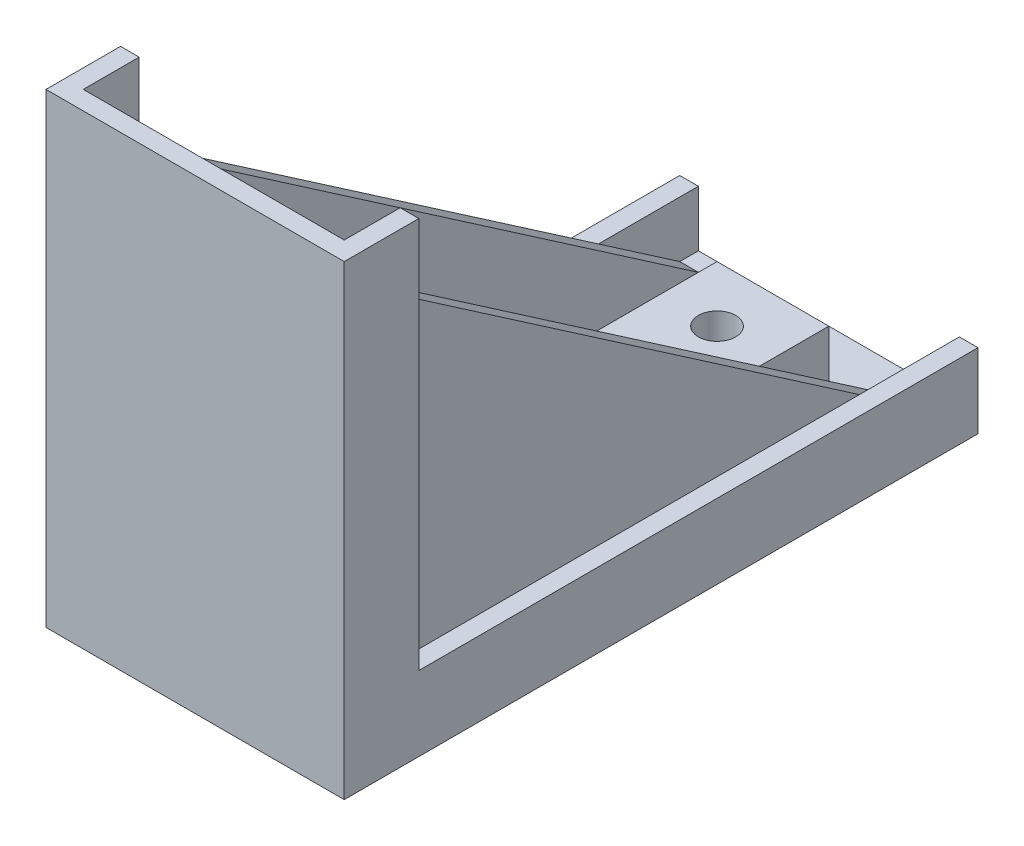
ISO-10303-21;
HEADER;
FILE_DESCRIPTION(('STEP AP214'),'2;1');
FILE_NAME('part.step','',(''),(''),'','','');
FILE_SCHEMA(('AUTOMOTIVE_DESIGN { 1 0 10303 214 1 1 1 1 }'));
ENDSEC;
DATA;
#1=APPLICATION_CONTEXT('core data for automotive mechanical design processes');
#2=APPLICATION_PROTOCOL_DEFINITION('international standard','automotive_design',2000,#1);
#3=PRODUCT_CONTEXT('',#1,'mechanical');
#4=PRODUCT('Part','Part','',(#3));
#5=PRODUCT_RELATED_PRODUCT_CATEGORY('part','',(#4));
#6=PRODUCT_DEFINITION_FORMATION('','',#4);
#7=PRODUCT_DEFINITION_CONTEXT('part definition',#1,'design');
#8=PRODUCT_DEFINITION('design','',#6,#7);
#9=PRODUCT_DEFINITION_SHAPE('','',#8);
#10=(LENGTH_UNIT() NAMED_UNIT(*) SI_UNIT(.MILLI.,.METRE.));
#11=(NAMED_UNIT(*) PLANE_ANGLE_UNIT() SI_UNIT($,.RADIAN.));
#12=(NAMED_UNIT(*) SI_UNIT($,.STERADIAN.) SOLID_ANGLE_UNIT());
#13=UNCERTAINTY_MEASURE_WITH_UNIT(LENGTH_MEASURE(1.E-05),#10,'distance_accuracy_value','');
#14=(GEOMETRIC_REPRESENTATION_CONTEXT(3) GLOBAL_UNCERTAINTY_ASSIGNED_CONTEXT((#13)) GLOBAL_UNIT_ASSIGNED_CONTEXT((#10,
#11,#12)) REPRESENTATION_CONTEXT('',''));
#15=CARTESIAN_POINT('',(0.,0.,0.));
#16=DIRECTION('',(0.,0.,1.));
#17=DIRECTION('',(1.,0.,0.));
#18=AXIS2_PLACEMENT_3D('',#15,#16,#17);
#19=CARTESIAN_POINT('',(-8.75,31.25,-1.25));
#20=DIRECTION('',(-1.,0.,0.));
#21=DIRECTION('',(0.,0.,1.));
#22=AXIS2_PLACEMENT_3D('',#19,#20,#21);
#23=PLANE('',#22);
#24=DIRECTION('',(0.,-1.,0.));
#25=VECTOR('',#24,1.);
#26=CARTESIAN_POINT('',(-8.75,31.25,-1.25));
#27=LINE('',#26,#25);
#28=CARTESIAN_POINT('',(-8.75,31.25,-1.25));
#29=VERTEX_POINT('',#28);
#30=CARTESIAN_POINT('',(-8.75,28.75,-1.25));
#31=VERTEX_POINT('',#30);
#32=EDGE_CURVE('E327',#29,#31,#27,.T.);
#33=ORIENTED_EDGE('',*,*,#32,.T.);
#34=DIRECTION('',(0.,0.566528822887065,0.824041924199368));
#35=VECTOR('',#34,1.);
#36=CARTESIAN_POINT('',(-8.75,1.25,-41.25));
#37=LINE('',#36,#35);
#38=CARTESIAN_POINT('',(-8.75,26.171875,-5.));
#39=VERTEX_POINT('',#38);
#40=EDGE_CURVE('E220',#39,#31,#37,.T.);
#41=ORIENTED_EDGE('',*,*,#40,.F.);
#42=DIRECTION('',(0.,-1.,0.));
#43=VECTOR('',#42,1.);
#44=CARTESIAN_POINT('',(-8.75,31.25,-5.));
#45=LINE('',#44,#43);
#46=CARTESIAN_POINT('',(-8.75,31.25,-5.));
#47=VERTEX_POINT('',#46);
#48=EDGE_CURVE('E324',#47,#39,#45,.T.);
#49=ORIENTED_EDGE('',*,*,#48,.F.);
#50=DIRECTION('',(0.,0.,-1.));
#51=VECTOR('',#50,1.);
#52=CARTESIAN_POINT('',(-8.75,31.25,-1.25));
#53=LINE('',#52,#51);
#54=EDGE_CURVE('E313',#29,#47,#53,.T.);
#55=ORIENTED_EDGE('',*,*,#54,.F.);
#56=EDGE_LOOP('',(#33,#41,#49,#55));
#57=FACE_BOUND('',#56,.T.);
#58=ADVANCED_FACE('F37',(#57),#23,.F.);
#59=CARTESIAN_POINT('',(8.75,31.25,-5.));
#60=DIRECTION('',(1.,0.,0.));
#61=DIRECTION('',(0.,0.,-1.));
#62=AXIS2_PLACEMENT_3D('',#59,#60,#61);
#63=PLANE('',#62);
#64=DIRECTION('',(0.,0.566528822887065,0.824041924199368));
#65=VECTOR('',#64,1.);
#66=CARTESIAN_POINT('',(8.75,1.25,-41.25));
#67=LINE('',#66,#65);
#68=CARTESIAN_POINT('',(8.75,26.171875,-5.));
#69=VERTEX_POINT('',#68);
#70=CARTESIAN_POINT('',(8.75,28.75,-1.25));
#71=VERTEX_POINT('',#70);
#72=EDGE_CURVE('E239',#69,#71,#67,.T.);
#73=ORIENTED_EDGE('',*,*,#72,.T.);
#74=DIRECTION('',(0.,-1.,0.));
#75=VECTOR('',#74,1.);
#76=CARTESIAN_POINT('',(8.75,31.25,-1.25));
#77=LINE('',#76,#75);
#78=CARTESIAN_POINT('',(8.75,31.25,-1.25));
#79=VERTEX_POINT('',#78);
#80=EDGE_CURVE('E330',#79,#71,#77,.T.);
#81=ORIENTED_EDGE('',*,*,#80,.F.);
#82=DIRECTION('',(0.,0.,1.));
#83=VECTOR('',#82,1.);
#84=CARTESIAN_POINT('',(8.75,31.25,-5.));
#85=LINE('',#84,#83);
#86=CARTESIAN_POINT('',(8.75,31.25,-5.));
#87=VERTEX_POINT('',#86);
#88=EDGE_CURVE('E309',#87,#79,#85,.T.);
#89=ORIENTED_EDGE('',*,*,#88,.F.);
#90=DIRECTION('',(0.,-1.,0.));
#91=VECTOR('',#90,1.);
#92=CARTESIAN_POINT('',(8.75,31.25,-5.));
#93=LINE('',#92,#91);
#94=EDGE_CURVE('E333',#87,#69,#93,.T.);
#95=ORIENTED_EDGE('',*,*,#94,.T.);
#96=EDGE_LOOP('',(#73,#81,#89,#95));
#97=FACE_BOUND('',#96,.T.);
#98=ADVANCED_FACE('F408',(#97),#63,.F.);
#99=CARTESIAN_POINT('',(8.75,1.25,-41.25));
#100=VERTEX_POINT('',#99);
#101=CARTESIAN_POINT('',(8.75,5.,-35.7954545454546));
#102=VERTEX_POINT('',#101);
#103=EDGE_CURVE('E235',#100,#102,#67,.T.);
#104=ORIENTED_EDGE('',*,*,#103,.T.);
#105=DIRECTION('',(0.,0.,1.));
#106=VECTOR('',#105,1.);
#107=CARTESIAN_POINT('',(8.75,5.,-42.5));
#108=LINE('',#107,#106);
#109=CARTESIAN_POINT('',(8.75,5.,-42.5));
#110=VERTEX_POINT('',#109);
#111=EDGE_CURVE('E275',#110,#102,#108,.T.);
#112=ORIENTED_EDGE('',*,*,#111,.F.);
#113=DIRECTION('',(0.,1.,0.));
#114=VECTOR('',#113,1.);
#115=CARTESIAN_POINT('',(8.75,1.25,-42.5));
#116=LINE('',#115,#114);
#117=CARTESIAN_POINT('',(8.75,1.25,-42.5));
#118=VERTEX_POINT('',#117);
#119=EDGE_CURVE('E273',#118,#110,#116,.T.);
#120=ORIENTED_EDGE('',*,*,#119,.F.);
#121=DIRECTION('',(0.,0.,1.));
#122=VECTOR('',#121,1.);
#123=CARTESIAN_POINT('',(8.75,1.25,-42.5));
#124=LINE('',#123,#122);
#125=EDGE_CURVE('E279',#118,#100,#124,.T.);
#126=ORIENTED_EDGE('',*,*,#125,.T.);
#127=EDGE_LOOP('',(#104,#112,#120,#126));
#128=FACE_BOUND('',#127,.T.);
#129=ADVANCED_FACE('F396',(#128),#63,.F.);
#130=CARTESIAN_POINT('',(8.75,31.25,-1.25));
#131=DIRECTION('',(0.,0.,1.));
#132=DIRECTION('',(1.,0.,0.));
#133=AXIS2_PLACEMENT_3D('',#130,#131,#132);
#134=PLANE('',#133);
#135=DIRECTION('',(0.,-1.,0.));
#136=VECTOR('',#135,1.);
#137=CARTESIAN_POINT('',(-7.5,28.75,-1.25));
#138=LINE('',#137,#136);
#139=CARTESIAN_POINT('',(-7.5,28.75,-1.25));
#140=VERTEX_POINT('',#139);
#141=CARTESIAN_POINT('',(-7.5,1.25,-1.25));
#142=VERTEX_POINT('',#141);
#143=EDGE_CURVE('E224',#140,#142,#138,.T.);
#144=ORIENTED_EDGE('',*,*,#143,.F.);
#145=DIRECTION('',(1.,0.,0.));
#146=VECTOR('',#145,1.);
#147=CARTESIAN_POINT('',(-8.75,28.75,-1.25));
#148=LINE('',#147,#146);
#149=EDGE_CURVE('E218',#31,#140,#148,.T.);
#150=ORIENTED_EDGE('',*,*,#149,.F.);
#151=ORIENTED_EDGE('',*,*,#32,.F.);
#152=DIRECTION('',(-1.,0.,0.));
#153=VECTOR('',#152,1.);
#154=CARTESIAN_POINT('',(8.75,31.25,-1.25));
#155=LINE('',#154,#153);
#156=EDGE_CURVE('E311',#79,#29,#155,.T.);
#157=ORIENTED_EDGE('',*,*,#156,.F.);
#158=ORIENTED_EDGE('',*,*,#80,.T.);
#159=DIRECTION('',(-1.,0.,0.));
#160=VECTOR('',#159,1.);
#161=CARTESIAN_POINT('',(8.75,28.75,-1.25));
#162=LINE('',#161,#160);
#163=CARTESIAN_POINT('',(7.5,28.75,-1.25));
#164=VERTEX_POINT('',#163);
#165=EDGE_CURVE('E249',#71,#164,#162,.T.);
#166=ORIENTED_EDGE('',*,*,#165,.T.);
#167=DIRECTION('',(0.,-1.,0.));
#168=VECTOR('',#167,1.);
#169=CARTESIAN_POINT('',(7.5,28.75,-1.25));
#170=LINE('',#169,#168);
#171=CARTESIAN_POINT('',(7.5,1.25,-1.25));
#172=VERTEX_POINT('',#171);
#173=EDGE_CURVE('E242',#164,#172,#170,.T.);
#174=ORIENTED_EDGE('',*,*,#173,.T.);
#175=DIRECTION('',(1.,0.,0.));
#176=VECTOR('',#175,1.);
#177=CARTESIAN_POINT('',(-8.75,1.25,-1.25));
#178=LINE('',#177,#176);
#179=EDGE_CURVE('E255',#142,#172,#178,.T.);
#180=ORIENTED_EDGE('',*,*,#179,.F.);
#181=EDGE_LOOP('',(#144,#150,#151,#157,#158,#166,#174,#180));
#182=FACE_BOUND('',#181,.T.);
#183=ADVANCED_FACE('F411',(#182),#134,.F.);
#184=CARTESIAN_POINT('',(-8.75000000000001,1.25,-42.5));
#185=DIRECTION('',(0.,-1.,0.));
#186=DIRECTION('',(1.,0.,0.));
#187=AXIS2_PLACEMENT_3D('',#184,#185,#186);
#188=PLANE('',#187);
#189=DIRECTION('',(0.,0.,1.));
#190=VECTOR('',#189,1.);
#191=CARTESIAN_POINT('',(-3.75,1.25,-38.75));
#192=LINE('',#191,#190);
#193=CARTESIAN_POINT('',(-3.75,1.25,-38.75));
#194=VERTEX_POINT('',#193);
#195=CARTESIAN_POINT('',(-3.75,1.25,-16.25));
#196=VERTEX_POINT('',#195);
#197=EDGE_CURVE('E206',#194,#196,#192,.T.);
#198=ORIENTED_EDGE('',*,*,#197,.F.);
#199=DIRECTION('',(-1.,0.,0.));
#200=VECTOR('',#199,1.);
#201=CARTESIAN_POINT('',(3.75,1.25,-38.75));
#202=LINE('',#201,#200);
#203=CARTESIAN_POINT('',(3.75,1.25,-38.75));
#204=VERTEX_POINT('',#203);
#205=EDGE_CURVE('E203',#204,#194,#202,.T.);
#206=ORIENTED_EDGE('',*,*,#205,.F.);
#207=DIRECTION('',(0.,0.,-1.));
#208=VECTOR('',#207,1.);
#209=CARTESIAN_POINT('',(3.75,1.25,-38.75));
#210=LINE('',#209,#208);
#211=CARTESIAN_POINT('',(3.75,1.25,-16.25));
#212=VERTEX_POINT('',#211);
#213=EDGE_CURVE('E57',#212,#204,#210,.T.);
#214=ORIENTED_EDGE('',*,*,#213,.F.);
#215=DIRECTION('',(1.,0.,0.));
#216=VECTOR('',#215,1.);
#217=CARTESIAN_POINT('',(3.75,1.25,-16.25));
#218=LINE('',#217,#216);
#219=EDGE_CURVE('E52',#196,#212,#218,.T.);
#220=ORIENTED_EDGE('',*,*,#219,.F.);
#221=EDGE_LOOP('',(#198,#206,#214,#220));
#222=FACE_BOUND('',#221,.T.);
#223=DIRECTION('',(0.,0.,1.));
#224=VECTOR('',#223,1.);
#225=CARTESIAN_POINT('',(-8.75000000000001,1.25,-42.5));
#226=LINE('',#225,#224);
#227=CARTESIAN_POINT('',(-8.75000000000001,1.25,-42.5));
#228=VERTEX_POINT('',#227);
#229=CARTESIAN_POINT('',(-8.75000000000001,1.25,-41.25));
#230=VERTEX_POINT('',#229);
#231=EDGE_CURVE('E282',#228,#230,#226,.T.);
#232=ORIENTED_EDGE('',*,*,#231,.T.);
#233=DIRECTION('',(1.,0.,0.));
#234=VECTOR('',#233,1.);
#235=CARTESIAN_POINT('',(-8.75,1.25,-41.25));
#236=LINE('',#235,#234);
#237=CARTESIAN_POINT('',(-7.5,1.25,-41.25));
#238=VERTEX_POINT('',#237);
#239=EDGE_CURVE('E229',#230,#238,#236,.T.);
#240=ORIENTED_EDGE('',*,*,#239,.T.);
#241=DIRECTION('',(0.,0.,-1.));
#242=VECTOR('',#241,1.);
#243=CARTESIAN_POINT('',(-7.5,1.25,-1.25));
#244=LINE('',#243,#242);
#245=EDGE_CURVE('E210',#142,#238,#244,.T.);
#246=ORIENTED_EDGE('',*,*,#245,.F.);
#247=ORIENTED_EDGE('',*,*,#179,.T.);
#248=DIRECTION('',(0.,0.,-1.));
#249=VECTOR('',#248,1.);
#250=CARTESIAN_POINT('',(7.5,1.25,-1.25));
#251=LINE('',#250,#249);
#252=CARTESIAN_POINT('',(7.5,1.25,-41.25));
#253=VERTEX_POINT('',#252);
#254=EDGE_CURVE('E245',#172,#253,#251,.T.);
#255=ORIENTED_EDGE('',*,*,#254,.T.);
#256=DIRECTION('',(-1.,0.,0.));
#257=VECTOR('',#256,1.);
#258=CARTESIAN_POINT('',(8.75,1.25,-41.25));
#259=LINE('',#258,#257);
#260=EDGE_CURVE('E237',#100,#253,#259,.T.);
#261=ORIENTED_EDGE('',*,*,#260,.F.);
#262=ORIENTED_EDGE('',*,*,#125,.F.);
#263=DIRECTION('',(1.,0.,0.));
#264=VECTOR('',#263,1.);
#265=CARTESIAN_POINT('',(-8.75000000000001,1.25,-42.5));
#266=LINE('',#265,#264);
#267=EDGE_CURVE('E271',#228,#118,#266,.T.);
#268=ORIENTED_EDGE('',*,*,#267,.F.);
#269=EDGE_LOOP('',(#232,#240,#246,#247,#255,#261,#262,#268));
#270=FACE_BOUND('',#269,.T.);
#271=ADVANCED_FACE('F393',(#222,#270),#188,.F.);
#272=CARTESIAN_POINT('',(10.,31.25,-5.));
#273=DIRECTION('',(0.,0.,1.));
#274=DIRECTION('',(1.,0.,0.));
#275=AXIS2_PLACEMENT_3D('',#272,#273,#274);
#276=PLANE('',#275);
#277=DIRECTION('',(1.,0.,0.));
#278=VECTOR('',#277,1.);
#279=CARTESIAN_POINT('',(10.,5.,-5.));
#280=LINE('',#279,#278);
#281=CARTESIAN_POINT('',(8.75,5.,-5.));
#282=VERTEX_POINT('',#281);
#283=CARTESIAN_POINT('',(10.,5.,-5.));
#284=VERTEX_POINT('',#283);
#285=EDGE_CURVE('E295',#282,#284,#280,.T.);
#286=ORIENTED_EDGE('',*,*,#285,.F.);
#287=DIRECTION('',(0.,1.,0.));
#288=VECTOR('',#287,1.);
#289=CARTESIAN_POINT('',(8.75,31.25,-5.));
#290=LINE('',#289,#288);
#291=EDGE_CURVE('E253',#282,#69,#290,.T.);
#292=ORIENTED_EDGE('',*,*,#291,.T.);
#293=ORIENTED_EDGE('',*,*,#94,.F.);
#294=DIRECTION('',(-1.,0.,0.));
#295=VECTOR('',#294,1.);
#296=CARTESIAN_POINT('',(10.,31.25,-5.));
#297=LINE('',#296,#295);
#298=CARTESIAN_POINT('',(10.,31.25,-5.));
#299=VERTEX_POINT('',#298);
#300=EDGE_CURVE('E307',#299,#87,#297,.T.);
#301=ORIENTED_EDGE('',*,*,#300,.F.);
#302=DIRECTION('',(0.,-1.,0.));
#303=VECTOR('',#302,1.);
#304=CARTESIAN_POINT('',(10.,31.25,-5.));
#305=LINE('',#304,#303);
#306=EDGE_CURVE('E336',#299,#284,#305,.T.);
#307=ORIENTED_EDGE('',*,*,#306,.T.);
#308=EDGE_LOOP('',(#286,#292,#293,#301,#307));
#309=FACE_BOUND('',#308,.T.);
#310=ADVANCED_FACE('F370',(#309),#276,.F.);
#311=DIRECTION('',(0.,0.,1.));
#312=VECTOR('',#311,1.);
#313=CARTESIAN_POINT('',(-8.75000000000001,5.,-42.5));
#314=LINE('',#313,#312);
#315=CARTESIAN_POINT('',(-8.75000000000001,5.,-42.5));
#316=VERTEX_POINT('',#315);
#317=CARTESIAN_POINT('',(-8.75000000000001,5.,-35.7954545454545));
#318=VERTEX_POINT('',#317);
#319=EDGE_CURVE('E286',#316,#318,#314,.T.);
#320=ORIENTED_EDGE('',*,*,#319,.T.);
#321=EDGE_CURVE('E216',#230,#318,#37,.T.);
#322=ORIENTED_EDGE('',*,*,#321,.F.);
#323=ORIENTED_EDGE('',*,*,#231,.F.);
#324=DIRECTION('',(0.,-1.,0.));
#325=VECTOR('',#324,1.);
#326=CARTESIAN_POINT('',(-8.75000000000001,5.,-42.5));
#327=LINE('',#326,#325);
#328=EDGE_CURVE('E269',#316,#228,#327,.T.);
#329=ORIENTED_EDGE('',*,*,#328,.F.);
#330=EDGE_LOOP('',(#320,#322,#323,#329));
#331=FACE_BOUND('',#330,.T.);
#332=ADVANCED_FACE('F390',(#331),#23,.F.);
#333=CARTESIAN_POINT('',(-8.75,31.25,-5.));
#334=DIRECTION('',(0.,0.,1.));
#335=DIRECTION('',(1.,0.,0.));
#336=AXIS2_PLACEMENT_3D('',#333,#334,#335);
#337=PLANE('',#336);
#338=DIRECTION('',(1.,0.,0.));
#339=VECTOR('',#338,1.);
#340=CARTESIAN_POINT('',(-8.75,5.,-5.));
#341=LINE('',#340,#339);
#342=CARTESIAN_POINT('',(-10.,5.,-5.));
#343=VERTEX_POINT('',#342);
#344=CARTESIAN_POINT('',(-8.75,5.,-5.));
#345=VERTEX_POINT('',#344);
#346=EDGE_CURVE('E11',#343,#345,#341,.T.);
#347=ORIENTED_EDGE('',*,*,#346,.F.);
#348=DIRECTION('',(0.,-1.,0.));
#349=VECTOR('',#348,1.);
#350=CARTESIAN_POINT('',(-10.,31.25,-5.));
#351=LINE('',#350,#349);
#352=CARTESIAN_POINT('',(-10.,31.25,-5.));
#353=VERTEX_POINT('',#352);
#354=EDGE_CURVE('E317',#353,#343,#351,.T.);
#355=ORIENTED_EDGE('',*,*,#354,.F.);
#356=DIRECTION('',(-1.,0.,0.));
#357=VECTOR('',#356,1.);
#358=CARTESIAN_POINT('',(-8.75,31.25,-5.));
#359=LINE('',#358,#357);
#360=EDGE_CURVE('E315',#47,#353,#359,.T.);
#361=ORIENTED_EDGE('',*,*,#360,.F.);
#362=ORIENTED_EDGE('',*,*,#48,.T.);
#363=DIRECTION('',(0.,-1.,0.));
#364=VECTOR('',#363,1.);
#365=CARTESIAN_POINT('',(-8.75,31.25,-5.));
#366=LINE('',#365,#364);
#367=EDGE_CURVE('E231',#39,#345,#366,.T.);
#368=ORIENTED_EDGE('',*,*,#367,.T.);
#369=EDGE_LOOP('',(#347,#355,#361,#362,#368));
#370=FACE_BOUND('',#369,.T.);
#371=ADVANCED_FACE('F380',(#370),#337,.F.);
#372=CARTESIAN_POINT('',(-10.,31.25,-5.));
#373=DIRECTION('',(1.,0.,0.));
#374=DIRECTION('',(0.,0.,-1.));
#375=AXIS2_PLACEMENT_3D('',#372,#373,#374);
#376=PLANE('',#375);
#377=ORIENTED_EDGE('',*,*,#354,.T.);
#378=DIRECTION('',(0.,0.,1.));
#379=VECTOR('',#378,1.);
#380=CARTESIAN_POINT('',(-10.,5.,-42.5));
#381=LINE('',#380,#379);
#382=CARTESIAN_POINT('',(-10.,5.,-42.5));
#383=VERTEX_POINT('',#382);
#384=EDGE_CURVE('E289',#383,#343,#381,.T.);
#385=ORIENTED_EDGE('',*,*,#384,.F.);
#386=DIRECTION('',(0.,1.,0.));
#387=VECTOR('',#386,1.);
#388=CARTESIAN_POINT('',(-10.,0.,-42.5));
#389=LINE('',#388,#387);
#390=CARTESIAN_POINT('',(-10.,0.,-42.5));
#391=VERTEX_POINT('',#390);
#392=EDGE_CURVE('E265',#391,#383,#389,.T.);
#393=ORIENTED_EDGE('',*,*,#392,.F.);
#394=DIRECTION('',(0.,0.,1.));
#395=VECTOR('',#394,1.);
#396=CARTESIAN_POINT('',(-10.,0.,-5.));
#397=LINE('',#396,#395);
#398=CARTESIAN_POINT('',(-10.,0.,0.));
#399=VERTEX_POINT('',#398);
#400=EDGE_CURVE('E298',#391,#399,#397,.T.);
#401=ORIENTED_EDGE('',*,*,#400,.T.);
#402=DIRECTION('',(0.,-1.,0.));
#403=VECTOR('',#402,1.);
#404=CARTESIAN_POINT('',(-10.,31.25,0.));
#405=LINE('',#404,#403);
#406=CARTESIAN_POINT('',(-10.,31.25,0.));
#407=VERTEX_POINT('',#406);
#408=EDGE_CURVE('E45',#407,#399,#405,.T.);
#409=ORIENTED_EDGE('',*,*,#408,.F.);
#410=DIRECTION('',(0.,0.,1.));
#411=VECTOR('',#410,1.);
#412=CARTESIAN_POINT('',(-10.,31.25,-5.));
#413=LINE('',#412,#411);
#414=EDGE_CURVE('E299',#353,#407,#413,.T.);
#415=ORIENTED_EDGE('',*,*,#414,.F.);
#416=EDGE_LOOP('',(#377,#385,#393,#401,#409,#415));
#417=FACE_BOUND('',#416,.T.);
#418=ADVANCED_FACE('F39',(#417),#376,.F.);
#419=CARTESIAN_POINT('',(-10.,31.25,0.));
#420=DIRECTION('',(0.,0.,-1.));
#421=DIRECTION('',(-1.,0.,0.));
#422=AXIS2_PLACEMENT_3D('',#419,#420,#421);
#423=PLANE('',#422);
#424=DIRECTION('',(1.,0.,0.));
#425=VECTOR('',#424,1.);
#426=CARTESIAN_POINT('',(-10.,0.,0.));
#427=LINE('',#426,#425);
#428=CARTESIAN_POINT('',(10.,0.,0.));
#429=VERTEX_POINT('',#428);
#430=EDGE_CURVE('E319',#399,#429,#427,.T.);
#431=ORIENTED_EDGE('',*,*,#430,.T.);
#432=DIRECTION('',(0.,-1.,0.));
#433=VECTOR('',#432,1.);
#434=CARTESIAN_POINT('',(10.,31.25,0.));
#435=LINE('',#434,#433);
#436=CARTESIAN_POINT('',(10.,31.25,0.));
#437=VERTEX_POINT('',#436);
#438=EDGE_CURVE('E338',#437,#429,#435,.T.);
#439=ORIENTED_EDGE('',*,*,#438,.F.);
#440=DIRECTION('',(1.,0.,0.));
#441=VECTOR('',#440,1.);
#442=CARTESIAN_POINT('',(-10.,31.25,0.));
#443=LINE('',#442,#441);
#444=EDGE_CURVE('E302',#407,#437,#443,.T.);
#445=ORIENTED_EDGE('',*,*,#444,.F.);
#446=ORIENTED_EDGE('',*,*,#408,.T.);
#447=EDGE_LOOP('',(#431,#439,#445,#446));
#448=FACE_BOUND('',#447,.T.);
#449=ADVANCED_FACE('F343',(#448),#423,.F.);
#450=CARTESIAN_POINT('',(10.,31.25,0.));
#451=DIRECTION('',(-1.,0.,0.));
#452=DIRECTION('',(0.,0.,1.));
#453=AXIS2_PLACEMENT_3D('',#450,#451,#452);
#454=PLANE('',#453);
#455=DIRECTION('',(0.,0.,-1.));
#456=VECTOR('',#455,1.);
#457=CARTESIAN_POINT('',(10.,0.,0.));
#458=LINE('',#457,#456);
#459=CARTESIAN_POINT('',(9.99999999999999,0.,-42.5));
#460=VERTEX_POINT('',#459);
#461=EDGE_CURVE('E303',#429,#460,#458,.T.);
#462=ORIENTED_EDGE('',*,*,#461,.T.);
#463=DIRECTION('',(0.,-1.,0.));
#464=VECTOR('',#463,1.);
#465=CARTESIAN_POINT('',(9.99999999999999,5.,-42.5));
#466=LINE('',#465,#464);
#467=CARTESIAN_POINT('',(9.99999999999999,5.,-42.5));
#468=VERTEX_POINT('',#467);
#469=EDGE_CURVE('E259',#468,#460,#466,.T.);
#470=ORIENTED_EDGE('',*,*,#469,.F.);
#471=DIRECTION('',(0.,0.,1.));
#472=VECTOR('',#471,1.);
#473=CARTESIAN_POINT('',(9.99999999999999,5.,-42.5));
#474=LINE('',#473,#472);
#475=EDGE_CURVE('E292',#468,#284,#474,.T.);
#476=ORIENTED_EDGE('',*,*,#475,.T.);
#477=ORIENTED_EDGE('',*,*,#306,.F.);
#478=DIRECTION('',(0.,0.,-1.));
#479=VECTOR('',#478,1.);
#480=CARTESIAN_POINT('',(10.,31.25,0.));
#481=LINE('',#480,#479);
#482=EDGE_CURVE('E305',#437,#299,#481,.T.);
#483=ORIENTED_EDGE('',*,*,#482,.F.);
#484=ORIENTED_EDGE('',*,*,#438,.T.);
#485=EDGE_LOOP('',(#462,#470,#476,#477,#483,#484));
#486=FACE_BOUND('',#485,.T.);
#487=ADVANCED_FACE('F355',(#486),#454,.F.);
#488=CARTESIAN_POINT('',(0.,31.25,0.));
#489=DIRECTION('',(0.,1.,0.));
#490=DIRECTION('',(0.,0.,1.));
#491=AXIS2_PLACEMENT_3D('',#488,#489,#490);
#492=PLANE('',#491);
#493=ORIENTED_EDGE('',*,*,#414,.T.);
#494=ORIENTED_EDGE('',*,*,#444,.T.);
#495=ORIENTED_EDGE('',*,*,#482,.T.);
#496=ORIENTED_EDGE('',*,*,#300,.T.);
#497=ORIENTED_EDGE('',*,*,#88,.T.);
#498=ORIENTED_EDGE('',*,*,#156,.T.);
#499=ORIENTED_EDGE('',*,*,#54,.T.);
#500=ORIENTED_EDGE('',*,*,#360,.T.);
#501=EDGE_LOOP('',(#493,#494,#495,#496,#497,#498,#499,#500));
#502=FACE_BOUND('',#501,.T.);
#503=ADVANCED_FACE('F373',(#502),#492,.T.);
#504=CARTESIAN_POINT('',(0.,0.,0.));
#505=DIRECTION('',(0.,1.,0.));
#506=DIRECTION('',(0.,0.,1.));
#507=AXIS2_PLACEMENT_3D('',#504,#505,#506);
#508=PLANE('',#507);
#509=CARTESIAN_POINT('',(0.,0.,-35.));
#510=DIRECTION('',(0.,1.,0.));
#511=DIRECTION('',(-1.,0.,0.));
#512=AXIS2_PLACEMENT_3D('',#509,#510,#511);
#513=CIRCLE('',#512,1.25);
#514=CARTESIAN_POINT('',(-1.25,0.,-35.));
#515=VERTEX_POINT('',#514);
#516=EDGE_CURVE('E762',#515,#515,#513,.T.);
#517=ORIENTED_EDGE('',*,*,#516,.T.);
#518=EDGE_LOOP('',(#517));
#519=FACE_BOUND('',#518,.T.);
#520=CARTESIAN_POINT('',(0.,0.,-25.));
#521=DIRECTION('',(0.,1.,0.));
#522=DIRECTION('',(-1.,0.,0.));
#523=AXIS2_PLACEMENT_3D('',#520,#521,#522);
#524=CIRCLE('',#523,1.25);
#525=CARTESIAN_POINT('',(-1.25,0.,-25.));
#526=VERTEX_POINT('',#525);
#527=EDGE_CURVE('E760',#526,#526,#524,.T.);
#528=ORIENTED_EDGE('',*,*,#527,.T.);
#529=EDGE_LOOP('',(#528));
#530=FACE_BOUND('',#529,.T.);
#531=ORIENTED_EDGE('',*,*,#400,.F.);
#532=DIRECTION('',(-1.,0.,0.));
#533=VECTOR('',#532,1.);
#534=CARTESIAN_POINT('',(9.99999999999999,0.,-42.5));
#535=LINE('',#534,#533);
#536=EDGE_CURVE('E262',#460,#391,#535,.T.);
#537=ORIENTED_EDGE('',*,*,#536,.F.);
#538=ORIENTED_EDGE('',*,*,#461,.F.);
#539=ORIENTED_EDGE('',*,*,#430,.F.);
#540=EDGE_LOOP('',(#531,#537,#538,#539));
#541=FACE_BOUND('',#540,.T.);
#542=ADVANCED_FACE('F353',(#519,#530,#541),#508,.F.);
#543=CARTESIAN_POINT('',(8.75,5.,-42.5));
#544=DIRECTION('',(0.,-1.,0.));
#545=DIRECTION('',(0.,0.,-1.));
#546=AXIS2_PLACEMENT_3D('',#543,#544,#545);
#547=PLANE('',#546);
#548=ORIENTED_EDGE('',*,*,#111,.T.);
#549=DIRECTION('',(0.,0.,1.));
#550=VECTOR('',#549,1.);
#551=CARTESIAN_POINT('',(8.75,5.,-42.5));
#552=LINE('',#551,#550);
#553=EDGE_CURVE('E251',#102,#282,#552,.T.);
#554=ORIENTED_EDGE('',*,*,#553,.T.);
#555=ORIENTED_EDGE('',*,*,#285,.T.);
#556=ORIENTED_EDGE('',*,*,#475,.F.);
#557=DIRECTION('',(1.,0.,0.));
#558=VECTOR('',#557,1.);
#559=CARTESIAN_POINT('',(8.75,5.,-42.5));
#560=LINE('',#559,#558);
#561=EDGE_CURVE('E256',#110,#468,#560,.T.);
#562=ORIENTED_EDGE('',*,*,#561,.F.);
#563=EDGE_LOOP('',(#548,#554,#555,#556,#562));
#564=FACE_BOUND('',#563,.T.);
#565=ADVANCED_FACE('F364',(#564),#547,.F.);
#566=CARTESIAN_POINT('',(-10.,5.,-42.5));
#567=DIRECTION('',(0.,-1.,0.));
#568=DIRECTION('',(0.,0.,-1.));
#569=AXIS2_PLACEMENT_3D('',#566,#567,#568);
#570=PLANE('',#569);
#571=ORIENTED_EDGE('',*,*,#384,.T.);
#572=ORIENTED_EDGE('',*,*,#346,.T.);
#573=EDGE_CURVE('E285',#318,#345,#314,.T.);
#574=ORIENTED_EDGE('',*,*,#573,.F.);
#575=ORIENTED_EDGE('',*,*,#319,.F.);
#576=DIRECTION('',(1.,0.,0.));
#577=VECTOR('',#576,1.);
#578=CARTESIAN_POINT('',(-10.,5.,-42.5));
#579=LINE('',#578,#577);
#580=EDGE_CURVE('E267',#383,#316,#579,.T.);
#581=ORIENTED_EDGE('',*,*,#580,.F.);
#582=EDGE_LOOP('',(#571,#572,#574,#575,#581));
#583=FACE_BOUND('',#582,.T.);
#584=ADVANCED_FACE('F383',(#583),#570,.F.);
#585=CARTESIAN_POINT('',(0.,0.,-42.5));
#586=DIRECTION('',(0.,0.,-1.));
#587=DIRECTION('',(-1.,0.,0.));
#588=AXIS2_PLACEMENT_3D('',#585,#586,#587);
#589=PLANE('',#588);
#590=ORIENTED_EDGE('',*,*,#561,.T.);
#591=ORIENTED_EDGE('',*,*,#469,.T.);
#592=ORIENTED_EDGE('',*,*,#536,.T.);
#593=ORIENTED_EDGE('',*,*,#392,.T.);
#594=ORIENTED_EDGE('',*,*,#580,.T.);
#595=ORIENTED_EDGE('',*,*,#328,.T.);
#596=ORIENTED_EDGE('',*,*,#267,.T.);
#597=ORIENTED_EDGE('',*,*,#119,.T.);
#598=EDGE_LOOP('',(#590,#591,#592,#593,#594,#595,#596,#597));
#599=FACE_BOUND('',#598,.T.);
#600=ADVANCED_FACE('F358',(#599),#589,.T.);
#601=CARTESIAN_POINT('',(8.75,0.,0.));
#602=DIRECTION('',(1.,0.,0.));
#603=DIRECTION('',(0.,0.,-1.));
#604=AXIS2_PLACEMENT_3D('',#601,#602,#603);
#605=PLANE('',#604);
#606=ORIENTED_EDGE('',*,*,#291,.F.);
#607=ORIENTED_EDGE('',*,*,#553,.F.);
#608=EDGE_CURVE('E238',#102,#69,#67,.T.);
#609=ORIENTED_EDGE('',*,*,#608,.T.);
#610=EDGE_LOOP('',(#606,#607,#609));
#611=FACE_BOUND('',#610,.T.);
#612=ADVANCED_FACE('F402',(#611),#605,.T.);
#613=CARTESIAN_POINT('',(8.75,1.25,-41.25));
#614=DIRECTION('',(0.,-0.824041924199368,0.566528822887065));
#615=DIRECTION('',(0.,-0.566528822887065,-0.824041924199368));
#616=AXIS2_PLACEMENT_3D('',#613,#614,#615);
#617=PLANE('',#616);
#618=DIRECTION('',(0.,0.566528822887065,0.824041924199368));
#619=VECTOR('',#618,1.);
#620=CARTESIAN_POINT('',(7.5,1.25,-41.25));
#621=LINE('',#620,#619);
#622=EDGE_CURVE('E234',#253,#164,#621,.T.);
#623=ORIENTED_EDGE('',*,*,#622,.T.);
#624=ORIENTED_EDGE('',*,*,#165,.F.);
#625=ORIENTED_EDGE('',*,*,#72,.F.);
#626=ORIENTED_EDGE('',*,*,#608,.F.);
#627=ORIENTED_EDGE('',*,*,#103,.F.);
#628=ORIENTED_EDGE('',*,*,#260,.T.);
#629=EDGE_LOOP('',(#623,#624,#625,#626,#627,#628));
#630=FACE_BOUND('',#629,.T.);
#631=ADVANCED_FACE('F405',(#630),#617,.F.);
#632=CARTESIAN_POINT('',(7.5,0.,0.));
#633=DIRECTION('',(1.,0.,0.));
#634=DIRECTION('',(0.,0.,-1.));
#635=AXIS2_PLACEMENT_3D('',#632,#633,#634);
#636=PLANE('',#635);
#637=ORIENTED_EDGE('',*,*,#622,.F.);
#638=ORIENTED_EDGE('',*,*,#254,.F.);
#639=ORIENTED_EDGE('',*,*,#173,.F.);
#640=EDGE_LOOP('',(#637,#638,#639));
#641=FACE_BOUND('',#640,.T.);
#642=ADVANCED_FACE('F417',(#641),#636,.F.);
#643=CARTESIAN_POINT('',(-8.75,0.,0.));
#644=DIRECTION('',(-1.,0.,0.));
#645=DIRECTION('',(0.,0.,-1.));
#646=AXIS2_PLACEMENT_3D('',#643,#644,#645);
#647=PLANE('',#646);
#648=ORIENTED_EDGE('',*,*,#367,.F.);
#649=EDGE_CURVE('E219',#318,#39,#37,.T.);
#650=ORIENTED_EDGE('',*,*,#649,.F.);
#651=ORIENTED_EDGE('',*,*,#573,.T.);
#652=EDGE_LOOP('',(#648,#650,#651));
#653=FACE_BOUND('',#652,.T.);
#654=ADVANCED_FACE('F431',(#653),#647,.T.);
#655=CARTESIAN_POINT('',(-8.75,1.25,-41.25));
#656=DIRECTION('',(0.,0.824041924199368,-0.566528822887065));
#657=DIRECTION('',(0.,0.566528822887065,0.824041924199368));
#658=AXIS2_PLACEMENT_3D('',#655,#656,#657);
#659=PLANE('',#658);
#660=DIRECTION('',(0.,0.566528822887065,0.824041924199368));
#661=VECTOR('',#660,1.);
#662=CARTESIAN_POINT('',(-7.5,1.25,-41.25));
#663=LINE('',#662,#661);
#664=EDGE_CURVE('E207',#238,#140,#663,.T.);
#665=ORIENTED_EDGE('',*,*,#664,.F.);
#666=ORIENTED_EDGE('',*,*,#239,.F.);
#667=ORIENTED_EDGE('',*,*,#321,.T.);
#668=ORIENTED_EDGE('',*,*,#649,.T.);
#669=ORIENTED_EDGE('',*,*,#40,.T.);
#670=ORIENTED_EDGE('',*,*,#149,.T.);
#671=EDGE_LOOP('',(#665,#666,#667,#668,#669,#670));
#672=FACE_BOUND('',#671,.T.);
#673=ADVANCED_FACE('F423',(#672),#659,.T.);
#674=CARTESIAN_POINT('',(-7.5,0.,0.));
#675=DIRECTION('',(-1.,0.,0.));
#676=DIRECTION('',(0.,0.,-1.));
#677=AXIS2_PLACEMENT_3D('',#674,#675,#676);
#678=PLANE('',#677);
#679=ORIENTED_EDGE('',*,*,#664,.T.);
#680=ORIENTED_EDGE('',*,*,#143,.T.);
#681=ORIENTED_EDGE('',*,*,#245,.T.);
#682=EDGE_LOOP('',(#679,#680,#681));
#683=FACE_BOUND('',#682,.T.);
#684=ADVANCED_FACE('F420',(#683),#678,.F.);
#685=CARTESIAN_POINT('',(0.,5.,0.));
#686=DIRECTION('',(0.,-1.,0.));
#687=DIRECTION('',(1.,0.,0.));
#688=AXIS2_PLACEMENT_3D('',#685,#686,#687);
#689=PLANE('',#688);
#690=DIRECTION('',(0.,0.,1.));
#691=VECTOR('',#690,1.);
#692=CARTESIAN_POINT('',(-3.75,5.,-38.75));
#693=LINE('',#692,#691);
#694=CARTESIAN_POINT('',(-3.75,5.,-38.75));
#695=VERTEX_POINT('',#694);
#696=CARTESIAN_POINT('',(-3.75,5.,-16.25));
#697=VERTEX_POINT('',#696);
#698=EDGE_CURVE('E193',#695,#697,#693,.T.);
#699=ORIENTED_EDGE('',*,*,#698,.T.);
#700=DIRECTION('',(1.,0.,0.));
#701=VECTOR('',#700,1.);
#702=CARTESIAN_POINT('',(3.75,5.,-16.25));
#703=LINE('',#702,#701);
#704=CARTESIAN_POINT('',(3.75,5.,-16.25));
#705=VERTEX_POINT('',#704);
#706=EDGE_CURVE('E182',#697,#705,#703,.T.);
#707=ORIENTED_EDGE('',*,*,#706,.T.);
#708=DIRECTION('',(0.,0.,-1.));
#709=VECTOR('',#708,1.);
#710=CARTESIAN_POINT('',(3.75,5.,-38.75));
#711=LINE('',#710,#709);
#712=CARTESIAN_POINT('',(3.75,5.,-38.75));
#713=VERTEX_POINT('',#712);
#714=EDGE_CURVE('E192',#705,#713,#711,.T.);
#715=ORIENTED_EDGE('',*,*,#714,.T.);
#716=DIRECTION('',(-1.,0.,0.));
#717=VECTOR('',#716,1.);
#718=CARTESIAN_POINT('',(3.75,5.,-38.75));
#719=LINE('',#718,#717);
#720=EDGE_CURVE('E199',#713,#695,#719,.T.);
#721=ORIENTED_EDGE('',*,*,#720,.T.);
#722=EDGE_LOOP('',(#699,#707,#715,#721));
#723=FACE_BOUND('',#722,.T.);
#724=CARTESIAN_POINT('',(0.,5.,-35.));
#725=DIRECTION('',(0.,1.,0.));
#726=DIRECTION('',(-1.,0.,0.));
#727=AXIS2_PLACEMENT_3D('',#724,#725,#726);
#728=CIRCLE('',#727,1.25);
#729=CARTESIAN_POINT('',(-1.25,5.,-35.));
#730=VERTEX_POINT('',#729);
#731=EDGE_CURVE('E768',#730,#730,#728,.T.);
#732=ORIENTED_EDGE('',*,*,#731,.F.);
#733=EDGE_LOOP('',(#732));
#734=FACE_BOUND('',#733,.T.);
#735=CARTESIAN_POINT('',(0.,5.,-25.));
#736=DIRECTION('',(0.,1.,0.));
#737=DIRECTION('',(-1.,0.,0.));
#738=AXIS2_PLACEMENT_3D('',#735,#736,#737);
#739=CIRCLE('',#738,1.25);
#740=CARTESIAN_POINT('',(-1.25,5.,-25.));
#741=VERTEX_POINT('',#740);
#742=EDGE_CURVE('E757',#741,#741,#739,.T.);
#743=ORIENTED_EDGE('',*,*,#742,.F.);
#744=EDGE_LOOP('',(#743));
#745=FACE_BOUND('',#744,.T.);
#746=ADVANCED_FACE('F196',(#723,#734,#745),#689,.F.);
#747=CARTESIAN_POINT('',(-3.75,5.,-38.75));
#748=DIRECTION('',(1.,0.,0.));
#749=DIRECTION('',(0.,1.,0.));
#750=AXIS2_PLACEMENT_3D('',#747,#748,#749);
#751=PLANE('',#750);
#752=ORIENTED_EDGE('',*,*,#197,.T.);
#753=DIRECTION('',(0.,-1.,0.));
#754=VECTOR('',#753,1.);
#755=CARTESIAN_POINT('',(-3.75,5.,-16.25));
#756=LINE('',#755,#754);
#757=EDGE_CURVE('E186',#697,#196,#756,.T.);
#758=ORIENTED_EDGE('',*,*,#757,.F.);
#759=ORIENTED_EDGE('',*,*,#698,.F.);
#760=DIRECTION('',(0.,-1.,0.));
#761=VECTOR('',#760,1.);
#762=CARTESIAN_POINT('',(-3.75,5.,-38.75));
#763=LINE('',#762,#761);
#764=EDGE_CURVE('E773',#695,#194,#763,.T.);
#765=ORIENTED_EDGE('',*,*,#764,.T.);
#766=EDGE_LOOP('',(#752,#758,#759,#765));
#767=FACE_BOUND('',#766,.T.);
#768=ADVANCED_FACE('F205',(#767),#751,.F.);
#769=CARTESIAN_POINT('',(3.75,5.,-16.25));
#770=DIRECTION('',(0.,0.,-1.));
#771=DIRECTION('',(0.,1.,0.));
#772=AXIS2_PLACEMENT_3D('',#769,#770,#771);
#773=PLANE('',#772);
#774=ORIENTED_EDGE('',*,*,#219,.T.);
#775=DIRECTION('',(0.,-1.,0.));
#776=VECTOR('',#775,1.);
#777=CARTESIAN_POINT('',(3.75,5.,-16.25));
#778=LINE('',#777,#776);
#779=EDGE_CURVE('E189',#705,#212,#778,.T.);
#780=ORIENTED_EDGE('',*,*,#779,.F.);
#781=ORIENTED_EDGE('',*,*,#706,.F.);
#782=ORIENTED_EDGE('',*,*,#757,.T.);
#783=EDGE_LOOP('',(#774,#780,#781,#782));
#784=FACE_BOUND('',#783,.T.);
#785=ADVANCED_FACE('F184',(#784),#773,.F.);
#786=CARTESIAN_POINT('',(3.75,5.,-38.75));
#787=DIRECTION('',(-1.,0.,0.));
#788=DIRECTION('',(0.,-1.,0.));
#789=AXIS2_PLACEMENT_3D('',#786,#787,#788);
#790=PLANE('',#789);
#791=ORIENTED_EDGE('',*,*,#213,.T.);
#792=DIRECTION('',(0.,-1.,0.));
#793=VECTOR('',#792,1.);
#794=CARTESIAN_POINT('',(3.75,5.,-38.75));
#795=LINE('',#794,#793);
#796=EDGE_CURVE('E212',#713,#204,#795,.T.);
#797=ORIENTED_EDGE('',*,*,#796,.F.);
#798=ORIENTED_EDGE('',*,*,#714,.F.);
#799=ORIENTED_EDGE('',*,*,#779,.T.);
#800=EDGE_LOOP('',(#791,#797,#798,#799));
#801=FACE_BOUND('',#800,.T.);
#802=ADVANCED_FACE('F548',(#801),#790,.F.);
#803=CARTESIAN_POINT('',(3.75,5.,-38.75));
#804=DIRECTION('',(0.,0.,1.));
#805=DIRECTION('',(0.,-1.,0.));
#806=AXIS2_PLACEMENT_3D('',#803,#804,#805);
#807=PLANE('',#806);
#808=ORIENTED_EDGE('',*,*,#205,.T.);
#809=ORIENTED_EDGE('',*,*,#764,.F.);
#810=ORIENTED_EDGE('',*,*,#720,.F.);
#811=ORIENTED_EDGE('',*,*,#796,.T.);
#812=EDGE_LOOP('',(#808,#809,#810,#811));
#813=FACE_BOUND('',#812,.T.);
#814=ADVANCED_FACE('F558',(#813),#807,.F.);
#815=CARTESIAN_POINT('',(0.,5.,-35.));
#816=DIRECTION('',(0.,-1.,0.));
#817=DIRECTION('',(1.,0.,0.));
#818=AXIS2_PLACEMENT_3D('',#815,#816,#817);
#819=CYLINDRICAL_SURFACE('',#818,1.25);
#820=ORIENTED_EDGE('',*,*,#731,.T.);
#821=EDGE_LOOP('',(#820));
#822=FACE_BOUND('',#821,.T.);
#823=ORIENTED_EDGE('',*,*,#516,.F.);
#824=EDGE_LOOP('',(#823));
#825=FACE_BOUND('',#824,.T.);
#826=ADVANCED_FACE('F569',(#822,#825),#819,.F.);
#827=CARTESIAN_POINT('',(0.,5.,-25.));
#828=DIRECTION('',(0.,-1.,0.));
#829=DIRECTION('',(1.,0.,0.));
#830=AXIS2_PLACEMENT_3D('',#827,#828,#829);
#831=CYLINDRICAL_SURFACE('',#830,1.25);
#832=ORIENTED_EDGE('',*,*,#742,.T.);
#833=EDGE_LOOP('',(#832));
#834=FACE_BOUND('',#833,.T.);
#835=ORIENTED_EDGE('',*,*,#527,.F.);
#836=EDGE_LOOP('',(#835));
#837=FACE_BOUND('',#836,.T.);
#838=ADVANCED_FACE('F593',(#834,#837),#831,.F.);
#839=CLOSED_SHELL('',(#58,#98,#129,#183,#271,#310,#332,#371,#418,#449,#487,#503,#542,#565,#584,
#600,#612,#631,#642,#654,#673,#684,#746,#768,#785,#802,#814,#826,#838));
#840=MANIFOLD_SOLID_BREP('B2',#839);
#841=ADVANCED_BREP_SHAPE_REPRESENTATION('',(#18,#840),#14);
#842=SHAPE_DEFINITION_REPRESENTATION(#9,#841);
ENDSEC;
END-ISO-10303-21;
